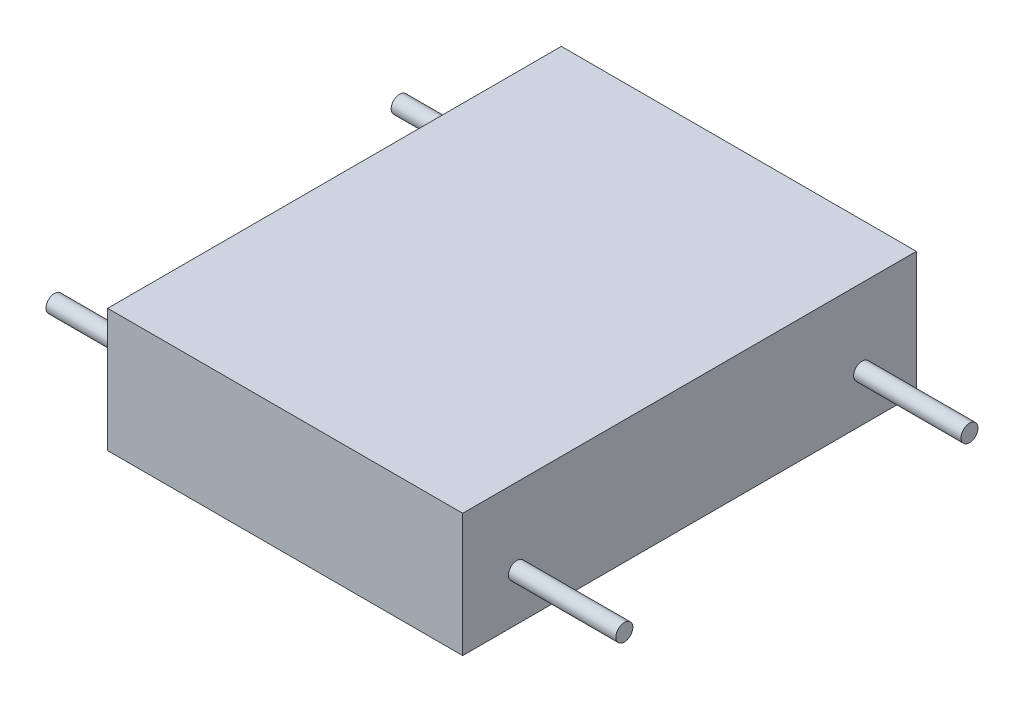
ISO-10303-21;
HEADER;
FILE_DESCRIPTION(('STEP AP214'),'2;1');
FILE_NAME('part.step','',(''),(''),'','','');
FILE_SCHEMA(('AUTOMOTIVE_DESIGN { 1 0 10303 214 1 1 1 1 }'));
ENDSEC;
DATA;
#1=APPLICATION_CONTEXT('core data for automotive mechanical design processes');
#2=APPLICATION_PROTOCOL_DEFINITION('international standard','automotive_design',2000,#1);
#3=PRODUCT_CONTEXT('',#1,'mechanical');
#4=PRODUCT('Part','Part','',(#3));
#5=PRODUCT_RELATED_PRODUCT_CATEGORY('part','',(#4));
#6=PRODUCT_DEFINITION_FORMATION('','',#4);
#7=PRODUCT_DEFINITION_CONTEXT('part definition',#1,'design');
#8=PRODUCT_DEFINITION('design','',#6,#7);
#9=PRODUCT_DEFINITION_SHAPE('','',#8);
#10=(LENGTH_UNIT() NAMED_UNIT(*) SI_UNIT(.MILLI.,.METRE.));
#11=(NAMED_UNIT(*) PLANE_ANGLE_UNIT() SI_UNIT($,.RADIAN.));
#12=(NAMED_UNIT(*) SI_UNIT($,.STERADIAN.) SOLID_ANGLE_UNIT());
#13=UNCERTAINTY_MEASURE_WITH_UNIT(LENGTH_MEASURE(1.E-05),#10,'distance_accuracy_value','');
#14=(GEOMETRIC_REPRESENTATION_CONTEXT(3) GLOBAL_UNCERTAINTY_ASSIGNED_CONTEXT((#13)) GLOBAL_UNIT_ASSIGNED_CONTEXT((#10,
#11,#12)) REPRESENTATION_CONTEXT('',''));
#15=CARTESIAN_POINT('',(0.,0.,0.));
#16=DIRECTION('',(0.,0.,1.));
#17=DIRECTION('',(1.,0.,0.));
#18=AXIS2_PLACEMENT_3D('',#15,#16,#17);
#19=CARTESIAN_POINT('',(-72.1535181236674,50.,-36.997867803838));
#20=DIRECTION('',(1.,0.,0.));
#21=DIRECTION('',(0.,0.,-1.));
#22=AXIS2_PLACEMENT_3D('',#19,#20,#21);
#23=PLANE('',#22);
#24=CARTESIAN_POINT('',(-72.1535181236673,19.,125.002132196162));
#25=DIRECTION('',(1.,0.,0.));
#26=DIRECTION('',(0.,0.,-1.));
#27=AXIS2_PLACEMENT_3D('',#24,#25,#26);
#28=CIRCLE('',#27,3.45);
#29=CARTESIAN_POINT('',(-72.1535181236673,19.,121.552132196162));
#30=VERTEX_POINT('',#29);
#31=EDGE_CURVE('E261',#30,#30,#28,.T.);
#32=ORIENTED_EDGE('',*,*,#31,.T.);
#33=EDGE_LOOP('',(#32));
#34=FACE_BOUND('',#33,.T.);
#35=CARTESIAN_POINT('',(-72.1535181236674,19.,-14.997867803838));
#36=DIRECTION('',(1.,0.,0.));
#37=DIRECTION('',(0.,0.,-1.));
#38=AXIS2_PLACEMENT_3D('',#35,#36,#37);
#39=CIRCLE('',#38,3.45);
#40=CARTESIAN_POINT('',(-72.1535181236674,19.,-18.447867803838));
#41=VERTEX_POINT('',#40);
#42=EDGE_CURVE('E46',#41,#41,#39,.F.);
#43=ORIENTED_EDGE('',*,*,#42,.F.);
#44=EDGE_LOOP('',(#43));
#45=FACE_BOUND('',#44,.T.);
#46=DIRECTION('',(0.,0.,1.));
#47=VECTOR('',#46,1.);
#48=CARTESIAN_POINT('',(-72.1535181236674,0.,-36.997867803838));
#49=LINE('',#48,#47);
#50=CARTESIAN_POINT('',(-72.1535181236674,0.,-36.997867803838));
#51=VERTEX_POINT('',#50);
#52=CARTESIAN_POINT('',(-72.1535181236673,0.,147.002132196162));
#53=VERTEX_POINT('',#52);
#54=EDGE_CURVE('E105',#51,#53,#49,.T.);
#55=ORIENTED_EDGE('',*,*,#54,.T.);
#56=DIRECTION('',(0.,-1.,0.));
#57=VECTOR('',#56,1.);
#58=CARTESIAN_POINT('',(-72.1535181236673,50.,147.002132196162));
#59=LINE('',#58,#57);
#60=CARTESIAN_POINT('',(-72.1535181236673,50.,147.002132196162));
#61=VERTEX_POINT('',#60);
#62=EDGE_CURVE('E96',#61,#53,#59,.T.);
#63=ORIENTED_EDGE('',*,*,#62,.F.);
#64=DIRECTION('',(0.,0.,1.));
#65=VECTOR('',#64,1.);
#66=CARTESIAN_POINT('',(-72.1535181236674,50.,-36.997867803838));
#67=LINE('',#66,#65);
#68=CARTESIAN_POINT('',(-72.1535181236674,50.,-36.997867803838));
#69=VERTEX_POINT('',#68);
#70=EDGE_CURVE('E90',#69,#61,#67,.T.);
#71=ORIENTED_EDGE('',*,*,#70,.F.);
#72=DIRECTION('',(0.,-1.,0.));
#73=VECTOR('',#72,1.);
#74=CARTESIAN_POINT('',(-72.1535181236674,50.,-36.997867803838));
#75=LINE('',#74,#73);
#76=EDGE_CURVE('E101',#69,#51,#75,.T.);
#77=ORIENTED_EDGE('',*,*,#76,.T.);
#78=EDGE_LOOP('',(#55,#63,#71,#77));
#79=FACE_BOUND('',#78,.T.);
#80=ADVANCED_FACE('F38',(#34,#45,#79),#23,.F.);
#81=CARTESIAN_POINT('',(-72.1535181236673,50.,147.002132196162));
#82=DIRECTION('',(0.,0.,-1.));
#83=DIRECTION('',(-1.,0.,0.));
#84=AXIS2_PLACEMENT_3D('',#81,#82,#83);
#85=PLANE('',#84);
#86=DIRECTION('',(1.,0.,0.));
#87=VECTOR('',#86,1.);
#88=CARTESIAN_POINT('',(-72.1535181236673,0.,147.002132196162));
#89=LINE('',#88,#87);
#90=CARTESIAN_POINT('',(71.8464818763327,0.,147.002132196162));
#91=VERTEX_POINT('',#90);
#92=EDGE_CURVE('E95',#53,#91,#89,.T.);
#93=ORIENTED_EDGE('',*,*,#92,.T.);
#94=DIRECTION('',(0.,-1.,0.));
#95=VECTOR('',#94,1.);
#96=CARTESIAN_POINT('',(71.8464818763327,50.,147.002132196162));
#97=LINE('',#96,#95);
#98=CARTESIAN_POINT('',(71.8464818763327,50.,147.002132196162));
#99=VERTEX_POINT('',#98);
#100=EDGE_CURVE('E93',#99,#91,#97,.T.);
#101=ORIENTED_EDGE('',*,*,#100,.F.);
#102=DIRECTION('',(1.,0.,0.));
#103=VECTOR('',#102,1.);
#104=CARTESIAN_POINT('',(-72.1535181236673,50.,147.002132196162));
#105=LINE('',#104,#103);
#106=EDGE_CURVE('E85',#61,#99,#105,.T.);
#107=ORIENTED_EDGE('',*,*,#106,.F.);
#108=ORIENTED_EDGE('',*,*,#62,.T.);
#109=EDGE_LOOP('',(#93,#101,#107,#108));
#110=FACE_BOUND('',#109,.T.);
#111=ADVANCED_FACE('F94',(#110),#85,.F.);
#112=CARTESIAN_POINT('',(71.8464818763326,50.,-36.997867803838));
#113=DIRECTION('',(-1.,0.,0.));
#114=DIRECTION('',(0.,0.,1.));
#115=AXIS2_PLACEMENT_3D('',#112,#113,#114);
#116=PLANE('',#115);
#117=CARTESIAN_POINT('',(71.8464818763327,19.,125.002132196162));
#118=DIRECTION('',(-1.,0.,0.));
#119=DIRECTION('',(0.,0.,1.));
#120=AXIS2_PLACEMENT_3D('',#117,#118,#119);
#121=CIRCLE('',#120,3.45);
#122=CARTESIAN_POINT('',(71.8464818763327,19.,128.452132196162));
#123=VERTEX_POINT('',#122);
#124=EDGE_CURVE('E11',#123,#123,#121,.F.);
#125=ORIENTED_EDGE('',*,*,#124,.F.);
#126=EDGE_LOOP('',(#125));
#127=FACE_BOUND('',#126,.T.);
#128=CARTESIAN_POINT('',(71.8464818763326,19.,-14.997867803838));
#129=DIRECTION('',(-1.,0.,0.));
#130=DIRECTION('',(0.,0.,1.));
#131=AXIS2_PLACEMENT_3D('',#128,#129,#130);
#132=CIRCLE('',#131,3.45);
#133=CARTESIAN_POINT('',(71.8464818763326,19.,-11.547867803838));
#134=VERTEX_POINT('',#133);
#135=EDGE_CURVE('E254',#134,#134,#132,.T.);
#136=ORIENTED_EDGE('',*,*,#135,.T.);
#137=EDGE_LOOP('',(#136));
#138=FACE_BOUND('',#137,.T.);
#139=DIRECTION('',(0.,0.,-1.));
#140=VECTOR('',#139,1.);
#141=CARTESIAN_POINT('',(71.8464818763326,0.,-36.997867803838));
#142=LINE('',#141,#140);
#143=CARTESIAN_POINT('',(71.8464818763326,0.,-36.997867803838));
#144=VERTEX_POINT('',#143);
#145=EDGE_CURVE('E71',#91,#144,#142,.T.);
#146=ORIENTED_EDGE('',*,*,#145,.T.);
#147=DIRECTION('',(0.,-1.,0.));
#148=VECTOR('',#147,1.);
#149=CARTESIAN_POINT('',(71.8464818763326,50.,-36.997867803838));
#150=LINE('',#149,#148);
#151=CARTESIAN_POINT('',(71.8464818763326,50.,-36.997867803838));
#152=VERTEX_POINT('',#151);
#153=EDGE_CURVE('E97',#152,#144,#150,.T.);
#154=ORIENTED_EDGE('',*,*,#153,.F.);
#155=DIRECTION('',(0.,0.,-1.));
#156=VECTOR('',#155,1.);
#157=CARTESIAN_POINT('',(71.8464818763326,50.,-36.997867803838));
#158=LINE('',#157,#156);
#159=EDGE_CURVE('E88',#99,#152,#158,.T.);
#160=ORIENTED_EDGE('',*,*,#159,.F.);
#161=ORIENTED_EDGE('',*,*,#100,.T.);
#162=EDGE_LOOP('',(#146,#154,#160,#161));
#163=FACE_BOUND('',#162,.T.);
#164=ADVANCED_FACE('F99',(#127,#138,#163),#116,.F.);
#165=CARTESIAN_POINT('',(-72.1535181236674,50.,-36.997867803838));
#166=DIRECTION('',(0.,0.,1.));
#167=DIRECTION('',(1.,0.,0.));
#168=AXIS2_PLACEMENT_3D('',#165,#166,#167);
#169=PLANE('',#168);
#170=DIRECTION('',(-1.,0.,0.));
#171=VECTOR('',#170,1.);
#172=CARTESIAN_POINT('',(-72.1535181236674,0.,-36.997867803838));
#173=LINE('',#172,#171);
#174=EDGE_CURVE('E77',#144,#51,#173,.T.);
#175=ORIENTED_EDGE('',*,*,#174,.T.);
#176=ORIENTED_EDGE('',*,*,#76,.F.);
#177=DIRECTION('',(-1.,0.,0.));
#178=VECTOR('',#177,1.);
#179=CARTESIAN_POINT('',(-72.1535181236674,50.,-36.997867803838));
#180=LINE('',#179,#178);
#181=EDGE_CURVE('E54',#152,#69,#180,.T.);
#182=ORIENTED_EDGE('',*,*,#181,.F.);
#183=ORIENTED_EDGE('',*,*,#153,.T.);
#184=EDGE_LOOP('',(#175,#176,#182,#183));
#185=FACE_BOUND('',#184,.T.);
#186=ADVANCED_FACE('F134',(#185),#169,.F.);
#187=CARTESIAN_POINT('',(0.,50.,0.));
#188=DIRECTION('',(0.,1.,0.));
#189=DIRECTION('',(0.,0.,1.));
#190=AXIS2_PLACEMENT_3D('',#187,#188,#189);
#191=PLANE('',#190);
#192=ORIENTED_EDGE('',*,*,#70,.T.);
#193=ORIENTED_EDGE('',*,*,#106,.T.);
#194=ORIENTED_EDGE('',*,*,#159,.T.);
#195=ORIENTED_EDGE('',*,*,#181,.T.);
#196=EDGE_LOOP('',(#192,#193,#194,#195));
#197=FACE_BOUND('',#196,.T.);
#198=ADVANCED_FACE('F86',(#197),#191,.T.);
#199=CARTESIAN_POINT('',(0.,0.,0.));
#200=DIRECTION('',(0.,1.,0.));
#201=DIRECTION('',(0.,0.,1.));
#202=AXIS2_PLACEMENT_3D('',#199,#200,#201);
#203=PLANE('',#202);
#204=ORIENTED_EDGE('',*,*,#54,.F.);
#205=ORIENTED_EDGE('',*,*,#174,.F.);
#206=ORIENTED_EDGE('',*,*,#145,.F.);
#207=ORIENTED_EDGE('',*,*,#92,.F.);
#208=EDGE_LOOP('',(#204,#205,#206,#207));
#209=FACE_BOUND('',#208,.T.);
#210=ADVANCED_FACE('F124',(#209),#203,.F.);
#211=CARTESIAN_POINT('',(-115.713518123667,19.,-14.9978678038379));
#212=DIRECTION('',(1.,0.,0.));
#213=DIRECTION('',(0.,0.,-1.));
#214=AXIS2_PLACEMENT_3D('',#211,#212,#213);
#215=CYLINDRICAL_SURFACE('',#214,3.45);
#216=CARTESIAN_POINT('',(-115.713518123667,19.,-14.9978678038379));
#217=DIRECTION('',(-1.,0.,0.));
#218=DIRECTION('',(0.,0.,1.));
#219=AXIS2_PLACEMENT_3D('',#216,#217,#218);
#220=CIRCLE('',#219,3.45);
#221=CARTESIAN_POINT('',(-115.713518123667,19.,-11.5478678038379));
#222=VERTEX_POINT('',#221);
#223=EDGE_CURVE('E108',#222,#222,#220,.T.);
#224=ORIENTED_EDGE('',*,*,#223,.F.);
#225=EDGE_LOOP('',(#224));
#226=FACE_BOUND('',#225,.T.);
#227=ORIENTED_EDGE('',*,*,#42,.T.);
#228=EDGE_LOOP('',(#227));
#229=FACE_BOUND('',#228,.T.);
#230=ADVANCED_FACE('F117',(#226,#229),#215,.T.);
#231=CARTESIAN_POINT('',(-115.713518123667,19.,-14.9978678038379));
#232=DIRECTION('',(-1.,0.,0.));
#233=DIRECTION('',(0.,0.,1.));
#234=AXIS2_PLACEMENT_3D('',#231,#232,#233);
#235=PLANE('',#234);
#236=ORIENTED_EDGE('',*,*,#223,.T.);
#237=EDGE_LOOP('',(#236));
#238=FACE_BOUND('',#237,.T.);
#239=ADVANCED_FACE('F131',(#238),#235,.T.);
#240=CARTESIAN_POINT('',(-115.713518123667,19.,125.002132196162));
#241=DIRECTION('',(1.,0.,0.));
#242=DIRECTION('',(0.,0.,-1.));
#243=AXIS2_PLACEMENT_3D('',#240,#241,#242);
#244=CYLINDRICAL_SURFACE('',#243,3.45);
#245=CARTESIAN_POINT('',(-115.713518123667,19.,125.002132196162));
#246=DIRECTION('',(1.,0.,0.));
#247=DIRECTION('',(0.,0.,-1.));
#248=AXIS2_PLACEMENT_3D('',#245,#246,#247);
#249=CIRCLE('',#248,3.45);
#250=CARTESIAN_POINT('',(-115.713518123667,19.,121.552132196162));
#251=VERTEX_POINT('',#250);
#252=EDGE_CURVE('E263',#251,#251,#249,.T.);
#253=ORIENTED_EDGE('',*,*,#252,.T.);
#254=EDGE_LOOP('',(#253));
#255=FACE_BOUND('',#254,.T.);
#256=ORIENTED_EDGE('',*,*,#31,.F.);
#257=EDGE_LOOP('',(#256));
#258=FACE_BOUND('',#257,.T.);
#259=ADVANCED_FACE('F177',(#255,#258),#244,.T.);
#260=CARTESIAN_POINT('',(-115.713518123667,19.,125.002132196162));
#261=DIRECTION('',(-1.,0.,0.));
#262=DIRECTION('',(0.,0.,-1.));
#263=AXIS2_PLACEMENT_3D('',#260,#261,#262);
#264=PLANE('',#263);
#265=ORIENTED_EDGE('',*,*,#252,.F.);
#266=EDGE_LOOP('',(#265));
#267=FACE_BOUND('',#266,.T.);
#268=ADVANCED_FACE('F197',(#267),#264,.T.);
#269=CARTESIAN_POINT('',(115.406481876333,19.,-14.997867803838));
#270=DIRECTION('',(-1.,0.,0.));
#271=DIRECTION('',(0.,0.,1.));
#272=AXIS2_PLACEMENT_3D('',#269,#270,#271);
#273=CYLINDRICAL_SURFACE('',#272,3.45);
#274=CARTESIAN_POINT('',(115.406481876333,19.,-14.997867803838));
#275=DIRECTION('',(-1.,0.,0.));
#276=DIRECTION('',(0.,0.,1.));
#277=AXIS2_PLACEMENT_3D('',#274,#275,#276);
#278=CIRCLE('',#277,3.45);
#279=CARTESIAN_POINT('',(115.406481876333,19.,-11.547867803838));
#280=VERTEX_POINT('',#279);
#281=EDGE_CURVE('E257',#280,#280,#278,.T.);
#282=ORIENTED_EDGE('',*,*,#281,.T.);
#283=EDGE_LOOP('',(#282));
#284=FACE_BOUND('',#283,.T.);
#285=ORIENTED_EDGE('',*,*,#135,.F.);
#286=EDGE_LOOP('',(#285));
#287=FACE_BOUND('',#286,.T.);
#288=ADVANCED_FACE('F204',(#284,#287),#273,.T.);
#289=CARTESIAN_POINT('',(115.406481876333,19.,-14.997867803838));
#290=DIRECTION('',(1.,0.,0.));
#291=DIRECTION('',(0.,0.,1.));
#292=AXIS2_PLACEMENT_3D('',#289,#290,#291);
#293=PLANE('',#292);
#294=ORIENTED_EDGE('',*,*,#281,.F.);
#295=EDGE_LOOP('',(#294));
#296=FACE_BOUND('',#295,.T.);
#297=ADVANCED_FACE('F212',(#296),#293,.T.);
#298=CARTESIAN_POINT('',(115.406481876333,19.,125.002132196162));
#299=DIRECTION('',(-1.,0.,0.));
#300=DIRECTION('',(0.,0.,1.));
#301=AXIS2_PLACEMENT_3D('',#298,#299,#300);
#302=CYLINDRICAL_SURFACE('',#301,3.45);
#303=CARTESIAN_POINT('',(115.406481876333,19.,125.002132196162));
#304=DIRECTION('',(1.,0.,0.));
#305=DIRECTION('',(0.,0.,-1.));
#306=AXIS2_PLACEMENT_3D('',#303,#304,#305);
#307=CIRCLE('',#306,3.45);
#308=CARTESIAN_POINT('',(115.406481876333,19.,121.552132196162));
#309=VERTEX_POINT('',#308);
#310=EDGE_CURVE('E253',#309,#309,#307,.T.);
#311=ORIENTED_EDGE('',*,*,#310,.F.);
#312=EDGE_LOOP('',(#311));
#313=FACE_BOUND('',#312,.T.);
#314=ORIENTED_EDGE('',*,*,#124,.T.);
#315=EDGE_LOOP('',(#314));
#316=FACE_BOUND('',#315,.T.);
#317=ADVANCED_FACE('F220',(#313,#316),#302,.T.);
#318=CARTESIAN_POINT('',(115.406481876333,19.,125.002132196162));
#319=DIRECTION('',(1.,0.,0.));
#320=DIRECTION('',(0.,0.,-1.));
#321=AXIS2_PLACEMENT_3D('',#318,#319,#320);
#322=PLANE('',#321);
#323=ORIENTED_EDGE('',*,*,#310,.T.);
#324=EDGE_LOOP('',(#323));
#325=FACE_BOUND('',#324,.T.);
#326=ADVANCED_FACE('F228',(#325),#322,.T.);
#327=CLOSED_SHELL('',(#80,#111,#164,#186,#198,#210,#230,#239,#259,#268,#288,#297,#317,#326));
#328=MANIFOLD_SOLID_BREP('B2',#327);
#329=ADVANCED_BREP_SHAPE_REPRESENTATION('',(#18,#328),#14);
#330=SHAPE_DEFINITION_REPRESENTATION(#9,#329);
ENDSEC;
END-ISO-10303-21;
